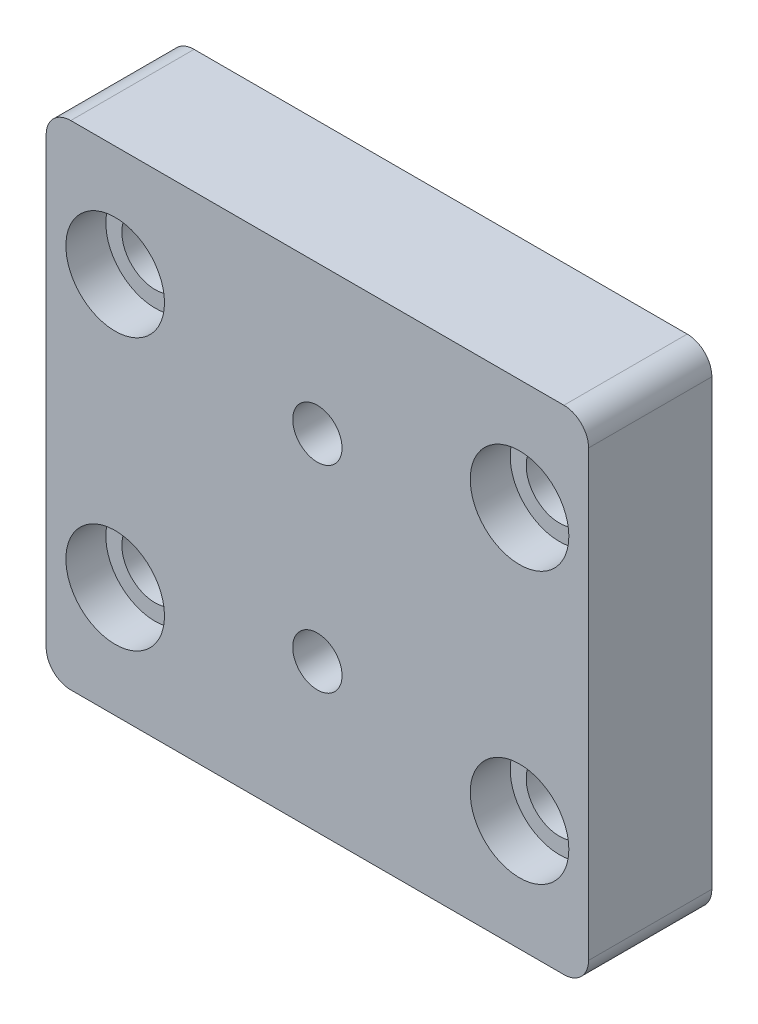
ISO-10303-21;
HEADER;
FILE_DESCRIPTION(('STEP AP214'),'2;1');
FILE_NAME('part.step','',(''),(''),'','','');
FILE_SCHEMA(('AUTOMOTIVE_DESIGN { 1 0 10303 214 1 1 1 1 }'));
ENDSEC;
DATA;
#1=APPLICATION_CONTEXT('core data for automotive mechanical design processes');
#2=APPLICATION_PROTOCOL_DEFINITION('international standard','automotive_design',2000,#1);
#3=PRODUCT_CONTEXT('',#1,'mechanical');
#4=PRODUCT('Part','Part','',(#3));
#5=PRODUCT_RELATED_PRODUCT_CATEGORY('part','',(#4));
#6=PRODUCT_DEFINITION_FORMATION('','',#4);
#7=PRODUCT_DEFINITION_CONTEXT('part definition',#1,'design');
#8=PRODUCT_DEFINITION('design','',#6,#7);
#9=PRODUCT_DEFINITION_SHAPE('','',#8);
#10=(LENGTH_UNIT() NAMED_UNIT(*) SI_UNIT(.MILLI.,.METRE.));
#11=(NAMED_UNIT(*) PLANE_ANGLE_UNIT() SI_UNIT($,.RADIAN.));
#12=(NAMED_UNIT(*) SI_UNIT($,.STERADIAN.) SOLID_ANGLE_UNIT());
#13=UNCERTAINTY_MEASURE_WITH_UNIT(LENGTH_MEASURE(1.E-05),#10,'distance_accuracy_value','');
#14=(GEOMETRIC_REPRESENTATION_CONTEXT(3) GLOBAL_UNCERTAINTY_ASSIGNED_CONTEXT((#13)) GLOBAL_UNIT_ASSIGNED_CONTEXT((#10,
#11,#12)) REPRESENTATION_CONTEXT('',''));
#15=CARTESIAN_POINT('',(0.,0.,0.));
#16=DIRECTION('',(0.,0.,1.));
#17=DIRECTION('',(1.,0.,0.));
#18=AXIS2_PLACEMENT_3D('',#15,#16,#17);
#19=CARTESIAN_POINT('',(55.,-50.,25.));
#20=DIRECTION('',(-1.,0.,0.));
#21=DIRECTION('',(0.,0.,1.));
#22=AXIS2_PLACEMENT_3D('',#19,#20,#21);
#23=PLANE('',#22);
#24=DIRECTION('',(0.,1.,0.));
#25=VECTOR('',#24,1.);
#26=CARTESIAN_POINT('',(55.,-50.,25.));
#27=LINE('',#26,#25);
#28=CARTESIAN_POINT('',(55.,-45.,25.));
#29=VERTEX_POINT('',#28);
#30=CARTESIAN_POINT('',(55.,45.,25.));
#31=VERTEX_POINT('',#30);
#32=EDGE_CURVE('E173',#29,#31,#27,.T.);
#33=ORIENTED_EDGE('',*,*,#32,.F.);
#34=DIRECTION('',(0.,0.,-1.));
#35=VECTOR('',#34,1.);
#36=CARTESIAN_POINT('',(55.,-45.,25.));
#37=LINE('',#36,#35);
#38=CARTESIAN_POINT('',(55.,-45.,0.));
#39=VERTEX_POINT('',#38);
#40=EDGE_CURVE('E220',#29,#39,#37,.T.);
#41=ORIENTED_EDGE('',*,*,#40,.T.);
#42=DIRECTION('',(0.,1.,0.));
#43=VECTOR('',#42,1.);
#44=CARTESIAN_POINT('',(55.,-50.,0.));
#45=LINE('',#44,#43);
#46=CARTESIAN_POINT('',(55.,45.,0.));
#47=VERTEX_POINT('',#46);
#48=EDGE_CURVE('E172',#39,#47,#45,.T.);
#49=ORIENTED_EDGE('',*,*,#48,.T.);
#50=DIRECTION('',(0.,0.,-1.));
#51=VECTOR('',#50,1.);
#52=CARTESIAN_POINT('',(55.,45.,25.));
#53=LINE('',#52,#51);
#54=EDGE_CURVE('E218',#47,#31,#53,.F.);
#55=ORIENTED_EDGE('',*,*,#54,.T.);
#56=EDGE_LOOP('',(#33,#41,#49,#55));
#57=FACE_BOUND('',#56,.T.);
#58=ADVANCED_FACE('F34',(#57),#23,.F.);
#59=CARTESIAN_POINT('',(-55.,50.,25.));
#60=DIRECTION('',(0.,-1.,0.));
#61=DIRECTION('',(0.,0.,-1.));
#62=AXIS2_PLACEMENT_3D('',#59,#60,#61);
#63=PLANE('',#62);
#64=DIRECTION('',(-1.,0.,0.));
#65=VECTOR('',#64,1.);
#66=CARTESIAN_POINT('',(-55.,50.,0.));
#67=LINE('',#66,#65);
#68=CARTESIAN_POINT('',(50.,50.,0.));
#69=VERTEX_POINT('',#68);
#70=CARTESIAN_POINT('',(-50.,50.,0.));
#71=VERTEX_POINT('',#70);
#72=EDGE_CURVE('E187',#69,#71,#67,.T.);
#73=ORIENTED_EDGE('',*,*,#72,.T.);
#74=DIRECTION('',(0.,0.,-1.));
#75=VECTOR('',#74,1.);
#76=CARTESIAN_POINT('',(-50.,50.,25.));
#77=LINE('',#76,#75);
#78=CARTESIAN_POINT('',(-50.,50.,25.));
#79=VERTEX_POINT('',#78);
#80=EDGE_CURVE('E11',#71,#79,#77,.F.);
#81=ORIENTED_EDGE('',*,*,#80,.T.);
#82=DIRECTION('',(-1.,0.,0.));
#83=VECTOR('',#82,1.);
#84=CARTESIAN_POINT('',(-55.,50.,25.));
#85=LINE('',#84,#83);
#86=CARTESIAN_POINT('',(50.,50.,25.));
#87=VERTEX_POINT('',#86);
#88=EDGE_CURVE('E175',#87,#79,#85,.T.);
#89=ORIENTED_EDGE('',*,*,#88,.F.);
#90=DIRECTION('',(0.,0.,-1.));
#91=VECTOR('',#90,1.);
#92=CARTESIAN_POINT('',(50.,50.,25.));
#93=LINE('',#92,#91);
#94=EDGE_CURVE('E42',#87,#69,#93,.T.);
#95=ORIENTED_EDGE('',*,*,#94,.T.);
#96=EDGE_LOOP('',(#73,#81,#89,#95));
#97=FACE_BOUND('',#96,.T.);
#98=ADVANCED_FACE('F225',(#97),#63,.F.);
#99=CARTESIAN_POINT('',(-55.,-50.,25.));
#100=DIRECTION('',(1.,0.,0.));
#101=DIRECTION('',(0.,0.,-1.));
#102=AXIS2_PLACEMENT_3D('',#99,#100,#101);
#103=PLANE('',#102);
#104=DIRECTION('',(0.,-1.,0.));
#105=VECTOR('',#104,1.);
#106=CARTESIAN_POINT('',(-55.,-50.,0.));
#107=LINE('',#106,#105);
#108=CARTESIAN_POINT('',(-55.,45.,0.));
#109=VERTEX_POINT('',#108);
#110=CARTESIAN_POINT('',(-55.,-45.,0.));
#111=VERTEX_POINT('',#110);
#112=EDGE_CURVE('E189',#109,#111,#107,.T.);
#113=ORIENTED_EDGE('',*,*,#112,.T.);
#114=DIRECTION('',(0.,0.,-1.));
#115=VECTOR('',#114,1.);
#116=CARTESIAN_POINT('',(-55.,-45.,25.));
#117=LINE('',#116,#115);
#118=CARTESIAN_POINT('',(-55.,-45.,25.));
#119=VERTEX_POINT('',#118);
#120=EDGE_CURVE('E209',#111,#119,#117,.F.);
#121=ORIENTED_EDGE('',*,*,#120,.T.);
#122=DIRECTION('',(0.,-1.,0.));
#123=VECTOR('',#122,1.);
#124=CARTESIAN_POINT('',(-55.,-50.,25.));
#125=LINE('',#124,#123);
#126=CARTESIAN_POINT('',(-55.,45.,25.));
#127=VERTEX_POINT('',#126);
#128=EDGE_CURVE('E178',#127,#119,#125,.T.);
#129=ORIENTED_EDGE('',*,*,#128,.F.);
#130=DIRECTION('',(0.,0.,-1.));
#131=VECTOR('',#130,1.);
#132=CARTESIAN_POINT('',(-55.,45.,25.));
#133=LINE('',#132,#131);
#134=EDGE_CURVE('E206',#127,#109,#133,.T.);
#135=ORIENTED_EDGE('',*,*,#134,.T.);
#136=EDGE_LOOP('',(#113,#121,#129,#135));
#137=FACE_BOUND('',#136,.T.);
#138=ADVANCED_FACE('F238',(#137),#103,.F.);
#139=CARTESIAN_POINT('',(-55.,-50.,25.));
#140=DIRECTION('',(0.,1.,0.));
#141=DIRECTION('',(0.,0.,1.));
#142=AXIS2_PLACEMENT_3D('',#139,#140,#141);
#143=PLANE('',#142);
#144=DIRECTION('',(1.,0.,0.));
#145=VECTOR('',#144,1.);
#146=CARTESIAN_POINT('',(-55.,-50.,25.));
#147=LINE('',#146,#145);
#148=CARTESIAN_POINT('',(-50.,-50.,25.));
#149=VERTEX_POINT('',#148);
#150=CARTESIAN_POINT('',(50.,-50.,25.));
#151=VERTEX_POINT('',#150);
#152=EDGE_CURVE('E181',#149,#151,#147,.T.);
#153=ORIENTED_EDGE('',*,*,#152,.F.);
#154=DIRECTION('',(0.,0.,-1.));
#155=VECTOR('',#154,1.);
#156=CARTESIAN_POINT('',(-50.,-50.,25.));
#157=LINE('',#156,#155);
#158=CARTESIAN_POINT('',(-50.,-50.,0.));
#159=VERTEX_POINT('',#158);
#160=EDGE_CURVE('E195',#149,#159,#157,.T.);
#161=ORIENTED_EDGE('',*,*,#160,.T.);
#162=DIRECTION('',(1.,0.,0.));
#163=VECTOR('',#162,1.);
#164=CARTESIAN_POINT('',(-55.,-50.,0.));
#165=LINE('',#164,#163);
#166=CARTESIAN_POINT('',(50.,-50.,0.));
#167=VERTEX_POINT('',#166);
#168=EDGE_CURVE('E176',#159,#167,#165,.T.);
#169=ORIENTED_EDGE('',*,*,#168,.T.);
#170=DIRECTION('',(0.,0.,-1.));
#171=VECTOR('',#170,1.);
#172=CARTESIAN_POINT('',(50.,-50.,25.));
#173=LINE('',#172,#171);
#174=EDGE_CURVE('E184',#167,#151,#173,.F.);
#175=ORIENTED_EDGE('',*,*,#174,.T.);
#176=EDGE_LOOP('',(#153,#161,#169,#175));
#177=FACE_BOUND('',#176,.T.);
#178=ADVANCED_FACE('F247',(#177),#143,.F.);
#179=CARTESIAN_POINT('',(0.,0.,25.));
#180=DIRECTION('',(0.,0.,-1.));
#181=DIRECTION('',(-1.,0.,0.));
#182=AXIS2_PLACEMENT_3D('',#179,#180,#181);
#183=PLANE('',#182);
#184=CARTESIAN_POINT('',(0.,20.,25.));
#185=DIRECTION('',(0.,0.,1.));
#186=DIRECTION('',(1.,0.,0.));
#187=AXIS2_PLACEMENT_3D('',#184,#185,#186);
#188=CIRCLE('',#187,4.99999999999999);
#189=CARTESIAN_POINT('',(4.99999999999999,20.,25.));
#190=VERTEX_POINT('',#189);
#191=EDGE_CURVE('E114',#190,#190,#188,.T.);
#192=ORIENTED_EDGE('',*,*,#191,.F.);
#193=EDGE_LOOP('',(#192));
#194=FACE_BOUND('',#193,.T.);
#195=CARTESIAN_POINT('',(0.,-20.,25.));
#196=DIRECTION('',(0.,0.,1.));
#197=DIRECTION('',(1.,0.,0.));
#198=AXIS2_PLACEMENT_3D('',#195,#196,#197);
#199=CIRCLE('',#198,4.99999999999999);
#200=CARTESIAN_POINT('',(4.99999999999999,-20.,25.));
#201=VERTEX_POINT('',#200);
#202=EDGE_CURVE('E113',#201,#201,#199,.T.);
#203=ORIENTED_EDGE('',*,*,#202,.F.);
#204=EDGE_LOOP('',(#203));
#205=FACE_BOUND('',#204,.T.);
#206=CARTESIAN_POINT('',(-41.,27.5,25.));
#207=DIRECTION('',(0.,0.,1.));
#208=DIRECTION('',(1.,0.,0.));
#209=AXIS2_PLACEMENT_3D('',#206,#207,#208);
#210=CIRCLE('',#209,9.99999999999999);
#211=CARTESIAN_POINT('',(-31.,27.5,25.));
#212=VERTEX_POINT('',#211);
#213=EDGE_CURVE('E124',#212,#212,#210,.T.);
#214=ORIENTED_EDGE('',*,*,#213,.F.);
#215=EDGE_LOOP('',(#214));
#216=FACE_BOUND('',#215,.T.);
#217=CARTESIAN_POINT('',(41.,27.5,25.));
#218=DIRECTION('',(0.,0.,1.));
#219=DIRECTION('',(1.,0.,0.));
#220=AXIS2_PLACEMENT_3D('',#217,#218,#219);
#221=CIRCLE('',#220,9.99999999999999);
#222=CARTESIAN_POINT('',(51.,27.5,25.));
#223=VERTEX_POINT('',#222);
#224=EDGE_CURVE('E136',#223,#223,#221,.T.);
#225=ORIENTED_EDGE('',*,*,#224,.F.);
#226=EDGE_LOOP('',(#225));
#227=FACE_BOUND('',#226,.T.);
#228=CARTESIAN_POINT('',(41.,-27.5,25.));
#229=DIRECTION('',(0.,0.,1.));
#230=DIRECTION('',(1.,0.,0.));
#231=AXIS2_PLACEMENT_3D('',#228,#229,#230);
#232=CIRCLE('',#231,9.99999999999999);
#233=CARTESIAN_POINT('',(51.,-27.5,25.));
#234=VERTEX_POINT('',#233);
#235=EDGE_CURVE('E148',#234,#234,#232,.T.);
#236=ORIENTED_EDGE('',*,*,#235,.F.);
#237=EDGE_LOOP('',(#236));
#238=FACE_BOUND('',#237,.T.);
#239=CARTESIAN_POINT('',(-41.,-27.5,25.));
#240=DIRECTION('',(0.,0.,1.));
#241=DIRECTION('',(1.,0.,0.));
#242=AXIS2_PLACEMENT_3D('',#239,#240,#241);
#243=CIRCLE('',#242,9.99999999999999);
#244=CARTESIAN_POINT('',(-31.,-27.5,25.));
#245=VERTEX_POINT('',#244);
#246=EDGE_CURVE('E160',#245,#245,#243,.T.);
#247=ORIENTED_EDGE('',*,*,#246,.F.);
#248=EDGE_LOOP('',(#247));
#249=FACE_BOUND('',#248,.T.);
#250=ORIENTED_EDGE('',*,*,#128,.T.);
#251=CARTESIAN_POINT('',(-50.,-45.,25.));
#252=DIRECTION('',(0.,0.,-1.));
#253=DIRECTION('',(-1.,0.,0.));
#254=AXIS2_PLACEMENT_3D('',#251,#252,#253);
#255=CIRCLE('',#254,5.);
#256=EDGE_CURVE('E216',#119,#149,#255,.F.);
#257=ORIENTED_EDGE('',*,*,#256,.T.);
#258=ORIENTED_EDGE('',*,*,#152,.T.);
#259=CARTESIAN_POINT('',(50.,-45.,25.));
#260=DIRECTION('',(0.,0.,-1.));
#261=DIRECTION('',(-1.,0.,0.));
#262=AXIS2_PLACEMENT_3D('',#259,#260,#261);
#263=CIRCLE('',#262,5.);
#264=EDGE_CURVE('E214',#151,#29,#263,.F.);
#265=ORIENTED_EDGE('',*,*,#264,.T.);
#266=ORIENTED_EDGE('',*,*,#32,.T.);
#267=CARTESIAN_POINT('',(50.,45.,25.));
#268=DIRECTION('',(0.,0.,-1.));
#269=DIRECTION('',(-1.,0.,0.));
#270=AXIS2_PLACEMENT_3D('',#267,#268,#269);
#271=CIRCLE('',#270,5.);
#272=EDGE_CURVE('E54',#31,#87,#271,.F.);
#273=ORIENTED_EDGE('',*,*,#272,.T.);
#274=ORIENTED_EDGE('',*,*,#88,.T.);
#275=CARTESIAN_POINT('',(-50.,45.,25.));
#276=DIRECTION('',(0.,0.,-1.));
#277=DIRECTION('',(-1.,0.,0.));
#278=AXIS2_PLACEMENT_3D('',#275,#276,#277);
#279=CIRCLE('',#278,5.);
#280=EDGE_CURVE('E212',#79,#127,#279,.F.);
#281=ORIENTED_EDGE('',*,*,#280,.T.);
#282=EDGE_LOOP('',(#250,#257,#258,#265,#266,#273,#274,#281));
#283=FACE_BOUND('',#282,.T.);
#284=ADVANCED_FACE('F241',(#194,#205,#216,#227,#238,#249,#283),#183,.F.);
#285=CARTESIAN_POINT('',(0.,0.,0.));
#286=DIRECTION('',(0.,0.,-1.));
#287=DIRECTION('',(-1.,0.,0.));
#288=AXIS2_PLACEMENT_3D('',#285,#286,#287);
#289=PLANE('',#288);
#290=CARTESIAN_POINT('',(-41.,27.5,0.));
#291=DIRECTION('',(0.,0.,1.));
#292=DIRECTION('',(1.,0.,0.));
#293=AXIS2_PLACEMENT_3D('',#290,#291,#292);
#294=CIRCLE('',#293,6.74999999999999);
#295=CARTESIAN_POINT('',(-34.25,27.5,0.));
#296=VERTEX_POINT('',#295);
#297=EDGE_CURVE('E133',#296,#296,#294,.T.);
#298=ORIENTED_EDGE('',*,*,#297,.T.);
#299=EDGE_LOOP('',(#298));
#300=FACE_BOUND('',#299,.T.);
#301=CARTESIAN_POINT('',(41.,27.5,0.));
#302=DIRECTION('',(0.,0.,1.));
#303=DIRECTION('',(1.,0.,0.));
#304=AXIS2_PLACEMENT_3D('',#301,#302,#303);
#305=CIRCLE('',#304,6.74999999999999);
#306=CARTESIAN_POINT('',(47.75,27.5,0.));
#307=VERTEX_POINT('',#306);
#308=EDGE_CURVE('E145',#307,#307,#305,.T.);
#309=ORIENTED_EDGE('',*,*,#308,.T.);
#310=EDGE_LOOP('',(#309));
#311=FACE_BOUND('',#310,.T.);
#312=CARTESIAN_POINT('',(41.,-27.5,0.));
#313=DIRECTION('',(0.,0.,1.));
#314=DIRECTION('',(1.,0.,0.));
#315=AXIS2_PLACEMENT_3D('',#312,#313,#314);
#316=CIRCLE('',#315,6.74999999999999);
#317=CARTESIAN_POINT('',(47.75,-27.5,0.));
#318=VERTEX_POINT('',#317);
#319=EDGE_CURVE('E157',#318,#318,#316,.T.);
#320=ORIENTED_EDGE('',*,*,#319,.T.);
#321=EDGE_LOOP('',(#320));
#322=FACE_BOUND('',#321,.T.);
#323=CARTESIAN_POINT('',(-41.,-27.5,0.));
#324=DIRECTION('',(0.,0.,1.));
#325=DIRECTION('',(1.,0.,0.));
#326=AXIS2_PLACEMENT_3D('',#323,#324,#325);
#327=CIRCLE('',#326,6.74999999999999);
#328=CARTESIAN_POINT('',(-34.25,-27.5,0.));
#329=VERTEX_POINT('',#328);
#330=EDGE_CURVE('E169',#329,#329,#327,.T.);
#331=ORIENTED_EDGE('',*,*,#330,.T.);
#332=EDGE_LOOP('',(#331));
#333=FACE_BOUND('',#332,.T.);
#334=ORIENTED_EDGE('',*,*,#168,.F.);
#335=CARTESIAN_POINT('',(-50.,-45.,0.));
#336=DIRECTION('',(0.,0.,-1.));
#337=DIRECTION('',(-1.,0.,0.));
#338=AXIS2_PLACEMENT_3D('',#335,#336,#337);
#339=CIRCLE('',#338,5.);
#340=EDGE_CURVE('E204',#159,#111,#339,.T.);
#341=ORIENTED_EDGE('',*,*,#340,.T.);
#342=ORIENTED_EDGE('',*,*,#112,.F.);
#343=CARTESIAN_POINT('',(-50.,45.,0.));
#344=DIRECTION('',(0.,0.,-1.));
#345=DIRECTION('',(-1.,0.,0.));
#346=AXIS2_PLACEMENT_3D('',#343,#344,#345);
#347=CIRCLE('',#346,5.);
#348=EDGE_CURVE('E200',#109,#71,#347,.T.);
#349=ORIENTED_EDGE('',*,*,#348,.T.);
#350=ORIENTED_EDGE('',*,*,#72,.F.);
#351=CARTESIAN_POINT('',(50.,45.,0.));
#352=DIRECTION('',(0.,0.,-1.));
#353=DIRECTION('',(-1.,0.,0.));
#354=AXIS2_PLACEMENT_3D('',#351,#352,#353);
#355=CIRCLE('',#354,5.);
#356=EDGE_CURVE('E198',#69,#47,#355,.T.);
#357=ORIENTED_EDGE('',*,*,#356,.T.);
#358=ORIENTED_EDGE('',*,*,#48,.F.);
#359=CARTESIAN_POINT('',(50.,-45.,0.));
#360=DIRECTION('',(0.,0.,-1.));
#361=DIRECTION('',(-1.,0.,0.));
#362=AXIS2_PLACEMENT_3D('',#359,#360,#361);
#363=CIRCLE('',#362,5.);
#364=EDGE_CURVE('E202',#39,#167,#363,.T.);
#365=ORIENTED_EDGE('',*,*,#364,.T.);
#366=EDGE_LOOP('',(#334,#341,#342,#349,#350,#357,#358,#365));
#367=FACE_BOUND('',#366,.T.);
#368=ADVANCED_FACE('F229',(#300,#311,#322,#333,#367),#289,.T.);
#369=CARTESIAN_POINT('',(-50.,-45.,25.));
#370=DIRECTION('',(0.,0.,-1.));
#371=DIRECTION('',(-1.,0.,0.));
#372=AXIS2_PLACEMENT_3D('',#369,#370,#371);
#373=CYLINDRICAL_SURFACE('',#372,5.);
#374=ORIENTED_EDGE('',*,*,#256,.F.);
#375=ORIENTED_EDGE('',*,*,#120,.F.);
#376=ORIENTED_EDGE('',*,*,#340,.F.);
#377=ORIENTED_EDGE('',*,*,#160,.F.);
#378=EDGE_LOOP('',(#374,#375,#376,#377));
#379=FACE_BOUND('',#378,.T.);
#380=ADVANCED_FACE('F245',(#379),#373,.T.);
#381=CARTESIAN_POINT('',(50.,-45.,25.));
#382=DIRECTION('',(0.,0.,-1.));
#383=DIRECTION('',(-1.,0.,0.));
#384=AXIS2_PLACEMENT_3D('',#381,#382,#383);
#385=CYLINDRICAL_SURFACE('',#384,5.);
#386=ORIENTED_EDGE('',*,*,#264,.F.);
#387=ORIENTED_EDGE('',*,*,#174,.F.);
#388=ORIENTED_EDGE('',*,*,#364,.F.);
#389=ORIENTED_EDGE('',*,*,#40,.F.);
#390=EDGE_LOOP('',(#386,#387,#388,#389));
#391=FACE_BOUND('',#390,.T.);
#392=ADVANCED_FACE('F252',(#391),#385,.T.);
#393=CARTESIAN_POINT('',(-50.,45.,25.));
#394=DIRECTION('',(0.,0.,-1.));
#395=DIRECTION('',(-1.,0.,0.));
#396=AXIS2_PLACEMENT_3D('',#393,#394,#395);
#397=CYLINDRICAL_SURFACE('',#396,5.);
#398=ORIENTED_EDGE('',*,*,#280,.F.);
#399=ORIENTED_EDGE('',*,*,#80,.F.);
#400=ORIENTED_EDGE('',*,*,#348,.F.);
#401=ORIENTED_EDGE('',*,*,#134,.F.);
#402=EDGE_LOOP('',(#398,#399,#400,#401));
#403=FACE_BOUND('',#402,.T.);
#404=ADVANCED_FACE('F235',(#403),#397,.T.);
#405=CARTESIAN_POINT('',(50.,45.,25.));
#406=DIRECTION('',(0.,0.,-1.));
#407=DIRECTION('',(-1.,0.,0.));
#408=AXIS2_PLACEMENT_3D('',#405,#406,#407);
#409=CYLINDRICAL_SURFACE('',#408,5.);
#410=ORIENTED_EDGE('',*,*,#272,.F.);
#411=ORIENTED_EDGE('',*,*,#54,.F.);
#412=ORIENTED_EDGE('',*,*,#356,.F.);
#413=ORIENTED_EDGE('',*,*,#94,.F.);
#414=EDGE_LOOP('',(#410,#411,#412,#413));
#415=FACE_BOUND('',#414,.T.);
#416=ADVANCED_FACE('F36',(#415),#409,.T.);
#417=CARTESIAN_POINT('',(-41.,-27.5,25.));
#418=DIRECTION('',(0.,0.,1.));
#419=DIRECTION('',(1.,0.,0.));
#420=AXIS2_PLACEMENT_3D('',#417,#418,#419);
#421=CYLINDRICAL_SURFACE('',#420,6.75);
#422=ORIENTED_EDGE('',*,*,#330,.F.);
#423=EDGE_LOOP('',(#422));
#424=FACE_BOUND('',#423,.T.);
#425=CARTESIAN_POINT('',(-41.,-27.5,16.9));
#426=DIRECTION('',(0.,0.,1.));
#427=DIRECTION('',(1.,0.,0.));
#428=AXIS2_PLACEMENT_3D('',#425,#426,#427);
#429=CIRCLE('',#428,6.75);
#430=CARTESIAN_POINT('',(-34.25,-27.5,16.9));
#431=VERTEX_POINT('',#430);
#432=EDGE_CURVE('E166',#431,#431,#429,.T.);
#433=ORIENTED_EDGE('',*,*,#432,.T.);
#434=EDGE_LOOP('',(#433));
#435=FACE_BOUND('',#434,.T.);
#436=ADVANCED_FACE('F257',(#424,#435),#421,.F.);
#437=CARTESIAN_POINT('',(-34.25,-27.5,16.9));
#438=DIRECTION('',(0.,0.,-1.));
#439=DIRECTION('',(-1.,0.,0.));
#440=AXIS2_PLACEMENT_3D('',#437,#438,#439);
#441=PLANE('',#440);
#442=ORIENTED_EDGE('',*,*,#432,.F.);
#443=EDGE_LOOP('',(#442));
#444=FACE_BOUND('',#443,.T.);
#445=CARTESIAN_POINT('',(-41.,-27.5,16.9));
#446=DIRECTION('',(0.,0.,1.));
#447=DIRECTION('',(1.,0.,0.));
#448=AXIS2_PLACEMENT_3D('',#445,#446,#447);
#449=CIRCLE('',#448,9.99999999999999);
#450=CARTESIAN_POINT('',(-31.,-27.5,16.9));
#451=VERTEX_POINT('',#450);
#452=EDGE_CURVE('E163',#451,#451,#449,.T.);
#453=ORIENTED_EDGE('',*,*,#452,.T.);
#454=EDGE_LOOP('',(#453));
#455=FACE_BOUND('',#454,.T.);
#456=ADVANCED_FACE('F262',(#444,#455),#441,.F.);
#457=CARTESIAN_POINT('',(-41.,-27.5,25.));
#458=DIRECTION('',(0.,0.,1.));
#459=DIRECTION('',(1.,0.,0.));
#460=AXIS2_PLACEMENT_3D('',#457,#458,#459);
#461=CYLINDRICAL_SURFACE('',#460,9.99999999999999);
#462=ORIENTED_EDGE('',*,*,#452,.F.);
#463=EDGE_LOOP('',(#462));
#464=FACE_BOUND('',#463,.T.);
#465=ORIENTED_EDGE('',*,*,#246,.T.);
#466=EDGE_LOOP('',(#465));
#467=FACE_BOUND('',#466,.T.);
#468=ADVANCED_FACE('F315',(#464,#467),#461,.F.);
#469=CARTESIAN_POINT('',(41.,-27.5,25.));
#470=DIRECTION('',(0.,0.,1.));
#471=DIRECTION('',(1.,0.,0.));
#472=AXIS2_PLACEMENT_3D('',#469,#470,#471);
#473=CYLINDRICAL_SURFACE('',#472,6.75);
#474=ORIENTED_EDGE('',*,*,#319,.F.);
#475=EDGE_LOOP('',(#474));
#476=FACE_BOUND('',#475,.T.);
#477=CARTESIAN_POINT('',(41.,-27.5,16.9));
#478=DIRECTION('',(0.,0.,1.));
#479=DIRECTION('',(1.,0.,0.));
#480=AXIS2_PLACEMENT_3D('',#477,#478,#479);
#481=CIRCLE('',#480,6.75);
#482=CARTESIAN_POINT('',(47.75,-27.5,16.9));
#483=VERTEX_POINT('',#482);
#484=EDGE_CURVE('E154',#483,#483,#481,.T.);
#485=ORIENTED_EDGE('',*,*,#484,.T.);
#486=EDGE_LOOP('',(#485));
#487=FACE_BOUND('',#486,.T.);
#488=ADVANCED_FACE('F325',(#476,#487),#473,.F.);
#489=CARTESIAN_POINT('',(47.75,-27.5,16.9));
#490=DIRECTION('',(0.,0.,-1.));
#491=DIRECTION('',(-1.,0.,0.));
#492=AXIS2_PLACEMENT_3D('',#489,#490,#491);
#493=PLANE('',#492);
#494=ORIENTED_EDGE('',*,*,#484,.F.);
#495=EDGE_LOOP('',(#494));
#496=FACE_BOUND('',#495,.T.);
#497=CARTESIAN_POINT('',(41.,-27.5,16.9));
#498=DIRECTION('',(0.,0.,1.));
#499=DIRECTION('',(1.,0.,0.));
#500=AXIS2_PLACEMENT_3D('',#497,#498,#499);
#501=CIRCLE('',#500,9.99999999999999);
#502=CARTESIAN_POINT('',(51.,-27.5,16.9));
#503=VERTEX_POINT('',#502);
#504=EDGE_CURVE('E151',#503,#503,#501,.T.);
#505=ORIENTED_EDGE('',*,*,#504,.T.);
#506=EDGE_LOOP('',(#505));
#507=FACE_BOUND('',#506,.T.);
#508=ADVANCED_FACE('F335',(#496,#507),#493,.F.);
#509=CARTESIAN_POINT('',(41.,-27.5,25.));
#510=DIRECTION('',(0.,0.,1.));
#511=DIRECTION('',(1.,0.,0.));
#512=AXIS2_PLACEMENT_3D('',#509,#510,#511);
#513=CYLINDRICAL_SURFACE('',#512,9.99999999999999);
#514=ORIENTED_EDGE('',*,*,#504,.F.);
#515=EDGE_LOOP('',(#514));
#516=FACE_BOUND('',#515,.T.);
#517=ORIENTED_EDGE('',*,*,#235,.T.);
#518=EDGE_LOOP('',(#517));
#519=FACE_BOUND('',#518,.T.);
#520=ADVANCED_FACE('F345',(#516,#519),#513,.F.);
#521=CARTESIAN_POINT('',(41.,27.5,25.));
#522=DIRECTION('',(0.,0.,1.));
#523=DIRECTION('',(1.,0.,0.));
#524=AXIS2_PLACEMENT_3D('',#521,#522,#523);
#525=CYLINDRICAL_SURFACE('',#524,6.75);
#526=ORIENTED_EDGE('',*,*,#308,.F.);
#527=EDGE_LOOP('',(#526));
#528=FACE_BOUND('',#527,.T.);
#529=CARTESIAN_POINT('',(41.,27.5,16.9));
#530=DIRECTION('',(0.,0.,1.));
#531=DIRECTION('',(1.,0.,0.));
#532=AXIS2_PLACEMENT_3D('',#529,#530,#531);
#533=CIRCLE('',#532,6.75);
#534=CARTESIAN_POINT('',(47.75,27.5,16.9));
#535=VERTEX_POINT('',#534);
#536=EDGE_CURVE('E142',#535,#535,#533,.T.);
#537=ORIENTED_EDGE('',*,*,#536,.T.);
#538=EDGE_LOOP('',(#537));
#539=FACE_BOUND('',#538,.T.);
#540=ADVANCED_FACE('F355',(#528,#539),#525,.F.);
#541=CARTESIAN_POINT('',(47.75,27.5,16.9));
#542=DIRECTION('',(0.,0.,-1.));
#543=DIRECTION('',(-1.,0.,0.));
#544=AXIS2_PLACEMENT_3D('',#541,#542,#543);
#545=PLANE('',#544);
#546=ORIENTED_EDGE('',*,*,#536,.F.);
#547=EDGE_LOOP('',(#546));
#548=FACE_BOUND('',#547,.T.);
#549=CARTESIAN_POINT('',(41.,27.5,16.9));
#550=DIRECTION('',(0.,0.,1.));
#551=DIRECTION('',(1.,0.,0.));
#552=AXIS2_PLACEMENT_3D('',#549,#550,#551);
#553=CIRCLE('',#552,9.99999999999999);
#554=CARTESIAN_POINT('',(51.,27.5,16.9));
#555=VERTEX_POINT('',#554);
#556=EDGE_CURVE('E139',#555,#555,#553,.T.);
#557=ORIENTED_EDGE('',*,*,#556,.T.);
#558=EDGE_LOOP('',(#557));
#559=FACE_BOUND('',#558,.T.);
#560=ADVANCED_FACE('F365',(#548,#559),#545,.F.);
#561=CARTESIAN_POINT('',(41.,27.5,25.));
#562=DIRECTION('',(0.,0.,1.));
#563=DIRECTION('',(1.,0.,0.));
#564=AXIS2_PLACEMENT_3D('',#561,#562,#563);
#565=CYLINDRICAL_SURFACE('',#564,9.99999999999999);
#566=ORIENTED_EDGE('',*,*,#556,.F.);
#567=EDGE_LOOP('',(#566));
#568=FACE_BOUND('',#567,.T.);
#569=ORIENTED_EDGE('',*,*,#224,.T.);
#570=EDGE_LOOP('',(#569));
#571=FACE_BOUND('',#570,.T.);
#572=ADVANCED_FACE('F375',(#568,#571),#565,.F.);
#573=CARTESIAN_POINT('',(-41.,27.5,25.));
#574=DIRECTION('',(0.,0.,1.));
#575=DIRECTION('',(1.,0.,0.));
#576=AXIS2_PLACEMENT_3D('',#573,#574,#575);
#577=CYLINDRICAL_SURFACE('',#576,6.75);
#578=ORIENTED_EDGE('',*,*,#297,.F.);
#579=EDGE_LOOP('',(#578));
#580=FACE_BOUND('',#579,.T.);
#581=CARTESIAN_POINT('',(-41.,27.5,16.9));
#582=DIRECTION('',(0.,0.,1.));
#583=DIRECTION('',(1.,0.,0.));
#584=AXIS2_PLACEMENT_3D('',#581,#582,#583);
#585=CIRCLE('',#584,6.75);
#586=CARTESIAN_POINT('',(-34.25,27.5,16.9));
#587=VERTEX_POINT('',#586);
#588=EDGE_CURVE('E130',#587,#587,#585,.T.);
#589=ORIENTED_EDGE('',*,*,#588,.T.);
#590=EDGE_LOOP('',(#589));
#591=FACE_BOUND('',#590,.T.);
#592=ADVANCED_FACE('F385',(#580,#591),#577,.F.);
#593=CARTESIAN_POINT('',(-34.25,27.5,16.9));
#594=DIRECTION('',(0.,0.,-1.));
#595=DIRECTION('',(-1.,0.,0.));
#596=AXIS2_PLACEMENT_3D('',#593,#594,#595);
#597=PLANE('',#596);
#598=ORIENTED_EDGE('',*,*,#588,.F.);
#599=EDGE_LOOP('',(#598));
#600=FACE_BOUND('',#599,.T.);
#601=CARTESIAN_POINT('',(-41.,27.5,16.9));
#602=DIRECTION('',(0.,0.,1.));
#603=DIRECTION('',(1.,0.,0.));
#604=AXIS2_PLACEMENT_3D('',#601,#602,#603);
#605=CIRCLE('',#604,9.99999999999999);
#606=CARTESIAN_POINT('',(-31.,27.5,16.9));
#607=VERTEX_POINT('',#606);
#608=EDGE_CURVE('E127',#607,#607,#605,.T.);
#609=ORIENTED_EDGE('',*,*,#608,.T.);
#610=EDGE_LOOP('',(#609));
#611=FACE_BOUND('',#610,.T.);
#612=ADVANCED_FACE('F395',(#600,#611),#597,.F.);
#613=CARTESIAN_POINT('',(-41.,27.5,25.));
#614=DIRECTION('',(0.,0.,1.));
#615=DIRECTION('',(1.,0.,0.));
#616=AXIS2_PLACEMENT_3D('',#613,#614,#615);
#617=CYLINDRICAL_SURFACE('',#616,9.99999999999999);
#618=ORIENTED_EDGE('',*,*,#608,.F.);
#619=EDGE_LOOP('',(#618));
#620=FACE_BOUND('',#619,.T.);
#621=ORIENTED_EDGE('',*,*,#213,.T.);
#622=EDGE_LOOP('',(#621));
#623=FACE_BOUND('',#622,.T.);
#624=ADVANCED_FACE('F405',(#620,#623),#617,.F.);
#625=CARTESIAN_POINT('',(0.,-20.,15.));
#626=DIRECTION('',(0.,0.,1.));
#627=DIRECTION('',(1.,0.,0.));
#628=AXIS2_PLACEMENT_3D('',#625,#626,#627);
#629=CONICAL_SURFACE('',#628,5.,1.02974425867665);
#630=CARTESIAN_POINT('',(0.,-20.,11.9956969048622));
#631=VERTEX_POINT('',#630);
#632=VERTEX_LOOP('',#631);
#633=FACE_BOUND('',#632,.T.);
#634=CARTESIAN_POINT('',(0.,-20.,15.));
#635=DIRECTION('',(0.,0.,1.));
#636=DIRECTION('',(1.,0.,0.));
#637=AXIS2_PLACEMENT_3D('',#634,#635,#636);
#638=CIRCLE('',#637,5.);
#639=CARTESIAN_POINT('',(5.,-20.,15.));
#640=VERTEX_POINT('',#639);
#641=EDGE_CURVE('E117',#640,#640,#638,.T.);
#642=ORIENTED_EDGE('',*,*,#641,.T.);
#643=EDGE_LOOP('',(#642));
#644=FACE_BOUND('',#643,.T.);
#645=ADVANCED_FACE('F415',(#633,#644),#629,.F.);
#646=CARTESIAN_POINT('',(0.,-20.,25.));
#647=DIRECTION('',(0.,0.,1.));
#648=DIRECTION('',(1.,0.,0.));
#649=AXIS2_PLACEMENT_3D('',#646,#647,#648);
#650=CYLINDRICAL_SURFACE('',#649,4.99999999999999);
#651=ORIENTED_EDGE('',*,*,#641,.F.);
#652=EDGE_LOOP('',(#651));
#653=FACE_BOUND('',#652,.T.);
#654=ORIENTED_EDGE('',*,*,#202,.T.);
#655=EDGE_LOOP('',(#654));
#656=FACE_BOUND('',#655,.T.);
#657=ADVANCED_FACE('F107',(#653,#656),#650,.F.);
#658=CARTESIAN_POINT('',(0.,20.,15.));
#659=DIRECTION('',(0.,0.,1.));
#660=DIRECTION('',(1.,0.,0.));
#661=AXIS2_PLACEMENT_3D('',#658,#659,#660);
#662=CONICAL_SURFACE('',#661,5.,1.02974425867665);
#663=CARTESIAN_POINT('',(0.,20.,11.9956969048622));
#664=VERTEX_POINT('',#663);
#665=VERTEX_LOOP('',#664);
#666=FACE_BOUND('',#665,.T.);
#667=CARTESIAN_POINT('',(0.,20.,15.));
#668=DIRECTION('',(0.,0.,1.));
#669=DIRECTION('',(1.,0.,0.));
#670=AXIS2_PLACEMENT_3D('',#667,#668,#669);
#671=CIRCLE('',#670,5.);
#672=CARTESIAN_POINT('',(5.,20.,15.));
#673=VERTEX_POINT('',#672);
#674=EDGE_CURVE('E111',#673,#673,#671,.T.);
#675=ORIENTED_EDGE('',*,*,#674,.T.);
#676=EDGE_LOOP('',(#675));
#677=FACE_BOUND('',#676,.T.);
#678=ADVANCED_FACE('F103',(#666,#677),#662,.F.);
#679=CARTESIAN_POINT('',(0.,20.,25.));
#680=DIRECTION('',(0.,0.,1.));
#681=DIRECTION('',(1.,0.,0.));
#682=AXIS2_PLACEMENT_3D('',#679,#680,#681);
#683=CYLINDRICAL_SURFACE('',#682,4.99999999999999);
#684=ORIENTED_EDGE('',*,*,#674,.F.);
#685=EDGE_LOOP('',(#684));
#686=FACE_BOUND('',#685,.T.);
#687=ORIENTED_EDGE('',*,*,#191,.T.);
#688=EDGE_LOOP('',(#687));
#689=FACE_BOUND('',#688,.T.);
#690=ADVANCED_FACE('F106',(#686,#689),#683,.F.);
#691=CLOSED_SHELL('',(#58,#98,#138,#178,#284,#368,#380,#392,#404,#416,#436,#456,#468,#488,#508,
#520,#540,#560,#572,#592,#612,#624,#645,#657,#678,#690));
#692=MANIFOLD_SOLID_BREP('B2',#691);
#693=ADVANCED_BREP_SHAPE_REPRESENTATION('',(#18,#692),#14);
#694=SHAPE_DEFINITION_REPRESENTATION(#9,#693);
ENDSEC;
END-ISO-10303-21;
